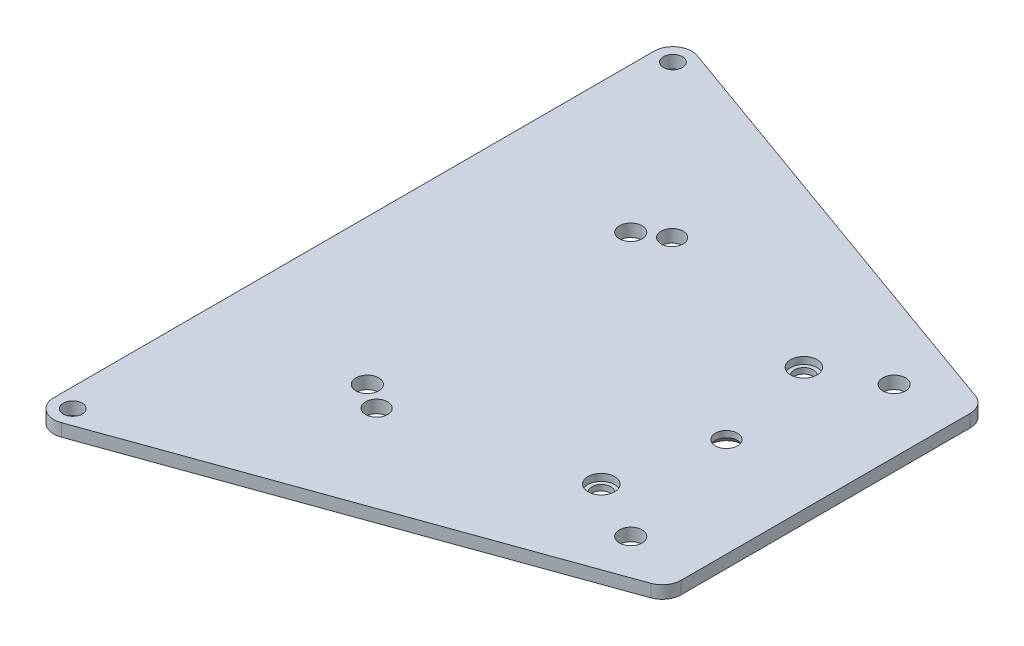
ISO-10303-21;
HEADER;
FILE_DESCRIPTION(('STEP AP214'),'2;1');
FILE_NAME('part.step','',(''),(''),'','','');
FILE_SCHEMA(('AUTOMOTIVE_DESIGN { 1 0 10303 214 1 1 1 1 }'));
ENDSEC;
DATA;
#1=APPLICATION_CONTEXT('core data for automotive mechanical design processes');
#2=APPLICATION_PROTOCOL_DEFINITION('international standard','automotive_design',2000,#1);
#3=PRODUCT_CONTEXT('',#1,'mechanical');
#4=PRODUCT('Part','Part','',(#3));
#5=PRODUCT_RELATED_PRODUCT_CATEGORY('part','',(#4));
#6=PRODUCT_DEFINITION_FORMATION('','',#4);
#7=PRODUCT_DEFINITION_CONTEXT('part definition',#1,'design');
#8=PRODUCT_DEFINITION('design','',#6,#7);
#9=PRODUCT_DEFINITION_SHAPE('','',#8);
#10=(LENGTH_UNIT() NAMED_UNIT(*) SI_UNIT(.MILLI.,.METRE.));
#11=(NAMED_UNIT(*) PLANE_ANGLE_UNIT() SI_UNIT($,.RADIAN.));
#12=(NAMED_UNIT(*) SI_UNIT($,.STERADIAN.) SOLID_ANGLE_UNIT());
#13=UNCERTAINTY_MEASURE_WITH_UNIT(LENGTH_MEASURE(1.E-05),#10,'distance_accuracy_value','');
#14=(GEOMETRIC_REPRESENTATION_CONTEXT(3) GLOBAL_UNCERTAINTY_ASSIGNED_CONTEXT((#13)) GLOBAL_UNIT_ASSIGNED_CONTEXT((#10,
#11,#12)) REPRESENTATION_CONTEXT('',''));
#15=CARTESIAN_POINT('',(0.,0.,0.));
#16=DIRECTION('',(0.,0.,1.));
#17=DIRECTION('',(1.,0.,0.));
#18=AXIS2_PLACEMENT_3D('',#15,#16,#17);
#19=CARTESIAN_POINT('',(52.22,2.,31.49));
#20=DIRECTION('',(0.,-1.,0.));
#21=DIRECTION('',(0.,0.,-1.));
#22=AXIS2_PLACEMENT_3D('',#19,#20,#21);
#23=CYLINDRICAL_SURFACE('',#22,1.5);
#24=CARTESIAN_POINT('',(52.22,0.,31.49));
#25=DIRECTION('',(0.,1.,0.));
#26=DIRECTION('',(0.,0.,1.));
#27=AXIS2_PLACEMENT_3D('',#24,#25,#26);
#28=CIRCLE('',#27,1.5);
#29=CARTESIAN_POINT('',(52.22,0.,32.99));
#30=VERTEX_POINT('',#29);
#31=EDGE_CURVE('E187',#30,#30,#28,.T.);
#32=ORIENTED_EDGE('',*,*,#31,.F.);
#33=EDGE_LOOP('',(#32));
#34=FACE_BOUND('',#33,.T.);
#35=CARTESIAN_POINT('',(52.22,0.9,31.49));
#36=DIRECTION('',(0.,1.,0.));
#37=DIRECTION('',(0.,0.,1.));
#38=AXIS2_PLACEMENT_3D('',#35,#36,#37);
#39=CIRCLE('',#38,1.5);
#40=CARTESIAN_POINT('',(52.22,0.9,32.99));
#41=VERTEX_POINT('',#40);
#42=EDGE_CURVE('E44',#41,#41,#39,.T.);
#43=ORIENTED_EDGE('',*,*,#42,.T.);
#44=EDGE_LOOP('',(#43));
#45=FACE_BOUND('',#44,.T.);
#46=ADVANCED_FACE('F41',(#34,#45),#23,.F.);
#47=CARTESIAN_POINT('',(52.22,2.,63.56));
#48=DIRECTION('',(0.,-1.,0.));
#49=DIRECTION('',(0.,0.,-1.));
#50=AXIS2_PLACEMENT_3D('',#47,#48,#49);
#51=CYLINDRICAL_SURFACE('',#50,1.5);
#52=CARTESIAN_POINT('',(52.22,0.,63.56));
#53=DIRECTION('',(0.,1.,0.));
#54=DIRECTION('',(0.,0.,1.));
#55=AXIS2_PLACEMENT_3D('',#52,#53,#54);
#56=CIRCLE('',#55,1.5);
#57=CARTESIAN_POINT('',(52.22,0.,65.06));
#58=VERTEX_POINT('',#57);
#59=EDGE_CURVE('E182',#58,#58,#56,.T.);
#60=ORIENTED_EDGE('',*,*,#59,.F.);
#61=EDGE_LOOP('',(#60));
#62=FACE_BOUND('',#61,.T.);
#63=CARTESIAN_POINT('',(52.22,0.9,63.56));
#64=DIRECTION('',(0.,1.,0.));
#65=DIRECTION('',(0.,0.,1.));
#66=AXIS2_PLACEMENT_3D('',#63,#64,#65);
#67=CIRCLE('',#66,1.5);
#68=CARTESIAN_POINT('',(52.22,0.9,65.06));
#69=VERTEX_POINT('',#68);
#70=EDGE_CURVE('E213',#69,#69,#67,.T.);
#71=ORIENTED_EDGE('',*,*,#70,.T.);
#72=EDGE_LOOP('',(#71));
#73=FACE_BOUND('',#72,.T.);
#74=ADVANCED_FACE('F288',(#62,#73),#51,.F.);
#75=CARTESIAN_POINT('',(56.,2.,47.525));
#76=DIRECTION('',(0.,-1.,0.));
#77=DIRECTION('',(0.,0.,-1.));
#78=AXIS2_PLACEMENT_3D('',#75,#76,#77);
#79=CYLINDRICAL_SURFACE('',#78,1.75);
#80=CARTESIAN_POINT('',(56.,2.,47.525));
#81=DIRECTION('',(0.,1.,0.));
#82=DIRECTION('',(0.,0.,1.));
#83=AXIS2_PLACEMENT_3D('',#80,#81,#82);
#84=CIRCLE('',#83,1.75);
#85=CARTESIAN_POINT('',(56.,2.,49.275));
#86=VERTEX_POINT('',#85);
#87=EDGE_CURVE('E245',#86,#86,#84,.T.);
#88=ORIENTED_EDGE('',*,*,#87,.T.);
#89=EDGE_LOOP('',(#88));
#90=FACE_BOUND('',#89,.T.);
#91=CARTESIAN_POINT('',(56.,1.,47.525));
#92=DIRECTION('',(0.,-1.,0.));
#93=DIRECTION('',(0.,0.,-1.));
#94=AXIS2_PLACEMENT_3D('',#91,#92,#93);
#95=CIRCLE('',#94,1.75);
#96=CARTESIAN_POINT('',(56.,1.,45.775));
#97=VERTEX_POINT('',#96);
#98=EDGE_CURVE('E159',#97,#97,#95,.T.);
#99=ORIENTED_EDGE('',*,*,#98,.T.);
#100=EDGE_LOOP('',(#99));
#101=FACE_BOUND('',#100,.T.);
#102=ADVANCED_FACE('F291',(#90,#101),#79,.F.);
#103=CARTESIAN_POINT('',(68.72,2.,24.6364483396855));
#104=DIRECTION('',(0.,-1.,0.));
#105=DIRECTION('',(0.,0.,-1.));
#106=AXIS2_PLACEMENT_3D('',#103,#104,#105);
#107=CYLINDRICAL_SURFACE('',#106,3.);
#108=CARTESIAN_POINT('',(68.72,0.,24.6364483396855));
#109=DIRECTION('',(0.,1.,0.));
#110=DIRECTION('',(0.,0.,1.));
#111=AXIS2_PLACEMENT_3D('',#108,#109,#110);
#112=CIRCLE('',#111,3.);
#113=CARTESIAN_POINT('',(69.7324194513645,0.,21.8124428767837));
#114=VERTEX_POINT('',#113);
#115=CARTESIAN_POINT('',(71.72,0.,24.6364483396855));
#116=VERTEX_POINT('',#115);
#117=EDGE_CURVE('E161',#114,#116,#112,.F.);
#118=ORIENTED_EDGE('',*,*,#117,.F.);
#119=DIRECTION('',(0.,-1.,0.));
#120=VECTOR('',#119,1.);
#121=CARTESIAN_POINT('',(69.7324194513645,2.,21.8124428767837));
#122=LINE('',#121,#120);
#123=CARTESIAN_POINT('',(69.7324194513645,2.,21.8124428767837));
#124=VERTEX_POINT('',#123);
#125=EDGE_CURVE('E11',#124,#114,#122,.T.);
#126=ORIENTED_EDGE('',*,*,#125,.F.);
#127=CARTESIAN_POINT('',(68.72,2.,24.6364483396855));
#128=DIRECTION('',(0.,1.,0.));
#129=DIRECTION('',(0.,0.,1.));
#130=AXIS2_PLACEMENT_3D('',#127,#128,#129);
#131=CIRCLE('',#130,3.);
#132=CARTESIAN_POINT('',(71.72,2.,24.6364483396855));
#133=VERTEX_POINT('',#132);
#134=EDGE_CURVE('E252',#124,#133,#131,.F.);
#135=ORIENTED_EDGE('',*,*,#134,.T.);
#136=DIRECTION('',(0.,-1.,0.));
#137=VECTOR('',#136,1.);
#138=CARTESIAN_POINT('',(71.72,2.,24.6364483396855));
#139=LINE('',#138,#137);
#140=EDGE_CURVE('E58',#133,#116,#139,.T.);
#141=ORIENTED_EDGE('',*,*,#140,.T.);
#142=EDGE_LOOP('',(#118,#126,#135,#141));
#143=FACE_BOUND('',#142,.T.);
#144=ADVANCED_FACE('F397',(#143),#107,.T.);
#145=CARTESIAN_POINT('',(1.01241945136449,2.,-2.82400546290173));
#146=DIRECTION('',(0.337473150454831,0.,-0.941335154300577));
#147=DIRECTION('',(-0.941335154300577,0.,-0.337473150454831));
#148=AXIS2_PLACEMENT_3D('',#145,#146,#147);
#149=PLANE('',#148);
#150=DIRECTION('',(0.941335154300577,0.,0.337473150454831));
#151=VECTOR('',#150,1.);
#152=CARTESIAN_POINT('',(1.01241945136449,0.,-2.82400546290173));
#153=LINE('',#152,#151);
#154=CARTESIAN_POINT('',(1.01241945136449,0.,-2.82400546290173));
#155=VERTEX_POINT('',#154);
#156=EDGE_CURVE('E164',#155,#114,#153,.T.);
#157=ORIENTED_EDGE('',*,*,#156,.F.);
#158=DIRECTION('',(0.,-1.,0.));
#159=VECTOR('',#158,1.);
#160=CARTESIAN_POINT('',(1.01241945136449,2.,-2.82400546290173));
#161=LINE('',#160,#159);
#162=CARTESIAN_POINT('',(1.01241945136449,2.,-2.82400546290173));
#163=VERTEX_POINT('',#162);
#164=EDGE_CURVE('E51',#163,#155,#161,.T.);
#165=ORIENTED_EDGE('',*,*,#164,.F.);
#166=DIRECTION('',(0.941335154300577,0.,0.337473150454831));
#167=VECTOR('',#166,1.);
#168=CARTESIAN_POINT('',(1.01241945136449,2.,-2.82400546290173));
#169=LINE('',#168,#167);
#170=EDGE_CURVE('E254',#163,#124,#169,.T.);
#171=ORIENTED_EDGE('',*,*,#170,.T.);
#172=ORIENTED_EDGE('',*,*,#125,.T.);
#173=EDGE_LOOP('',(#157,#165,#171,#172));
#174=FACE_BOUND('',#173,.T.);
#175=ADVANCED_FACE('F489',(#174),#149,.T.);
#176=CARTESIAN_POINT('',(0.,2.,0.));
#177=DIRECTION('',(0.,-1.,0.));
#178=DIRECTION('',(0.,0.,-1.));
#179=AXIS2_PLACEMENT_3D('',#176,#177,#178);
#180=CYLINDRICAL_SURFACE('',#179,3.);
#181=CARTESIAN_POINT('',(0.,0.,0.));
#182=DIRECTION('',(0.,1.,0.));
#183=DIRECTION('',(0.,0.,1.));
#184=AXIS2_PLACEMENT_3D('',#181,#182,#183);
#185=CIRCLE('',#184,3.);
#186=CARTESIAN_POINT('',(-3.,0.,0.));
#187=VERTEX_POINT('',#186);
#188=EDGE_CURVE('E166',#187,#155,#185,.F.);
#189=ORIENTED_EDGE('',*,*,#188,.F.);
#190=DIRECTION('',(0.,-1.,0.));
#191=VECTOR('',#190,1.);
#192=CARTESIAN_POINT('',(-3.,2.,0.));
#193=LINE('',#192,#191);
#194=CARTESIAN_POINT('',(-3.,2.,0.));
#195=VERTEX_POINT('',#194);
#196=EDGE_CURVE('E208',#195,#187,#193,.T.);
#197=ORIENTED_EDGE('',*,*,#196,.F.);
#198=CARTESIAN_POINT('',(0.,2.,0.));
#199=DIRECTION('',(0.,1.,0.));
#200=DIRECTION('',(0.,0.,1.));
#201=AXIS2_PLACEMENT_3D('',#198,#199,#200);
#202=CIRCLE('',#201,3.);
#203=EDGE_CURVE('E257',#195,#163,#202,.F.);
#204=ORIENTED_EDGE('',*,*,#203,.T.);
#205=ORIENTED_EDGE('',*,*,#164,.T.);
#206=EDGE_LOOP('',(#189,#197,#204,#205));
#207=FACE_BOUND('',#206,.T.);
#208=ADVANCED_FACE('F483',(#207),#180,.T.);
#209=CARTESIAN_POINT('',(-3.,2.,0.));
#210=DIRECTION('',(-1.,0.,0.));
#211=DIRECTION('',(0.,0.,1.));
#212=AXIS2_PLACEMENT_3D('',#209,#210,#211);
#213=PLANE('',#212);
#214=DIRECTION('',(0.,0.,-1.));
#215=VECTOR('',#214,1.);
#216=CARTESIAN_POINT('',(-3.,0.,0.));
#217=LINE('',#216,#215);
#218=CARTESIAN_POINT('',(-3.,0.,95.05));
#219=VERTEX_POINT('',#218);
#220=EDGE_CURVE('E171',#219,#187,#217,.T.);
#221=ORIENTED_EDGE('',*,*,#220,.F.);
#222=DIRECTION('',(0.,-1.,0.));
#223=VECTOR('',#222,1.);
#224=CARTESIAN_POINT('',(-3.,2.,95.05));
#225=LINE('',#224,#223);
#226=CARTESIAN_POINT('',(-3.,2.,95.05));
#227=VERTEX_POINT('',#226);
#228=EDGE_CURVE('E206',#227,#219,#225,.T.);
#229=ORIENTED_EDGE('',*,*,#228,.F.);
#230=DIRECTION('',(0.,0.,-1.));
#231=VECTOR('',#230,1.);
#232=CARTESIAN_POINT('',(-3.,2.,0.));
#233=LINE('',#232,#231);
#234=EDGE_CURVE('E256',#227,#195,#233,.T.);
#235=ORIENTED_EDGE('',*,*,#234,.T.);
#236=ORIENTED_EDGE('',*,*,#196,.T.);
#237=EDGE_LOOP('',(#221,#229,#235,#236));
#238=FACE_BOUND('',#237,.T.);
#239=ADVANCED_FACE('F474',(#238),#213,.T.);
#240=CARTESIAN_POINT('',(0.,2.,95.05));
#241=DIRECTION('',(0.,-1.,0.));
#242=DIRECTION('',(0.,0.,-1.));
#243=AXIS2_PLACEMENT_3D('',#240,#241,#242);
#244=CYLINDRICAL_SURFACE('',#243,3.);
#245=CARTESIAN_POINT('',(0.,0.,95.05));
#246=DIRECTION('',(0.,1.,0.));
#247=DIRECTION('',(0.,0.,1.));
#248=AXIS2_PLACEMENT_3D('',#245,#246,#247);
#249=CIRCLE('',#248,3.);
#250=CARTESIAN_POINT('',(1.01241945136449,0.,97.8740054629017));
#251=VERTEX_POINT('',#250);
#252=EDGE_CURVE('E172',#251,#219,#249,.F.);
#253=ORIENTED_EDGE('',*,*,#252,.F.);
#254=DIRECTION('',(0.,-1.,0.));
#255=VECTOR('',#254,1.);
#256=CARTESIAN_POINT('',(1.01241945136449,2.,97.8740054629017));
#257=LINE('',#256,#255);
#258=CARTESIAN_POINT('',(1.01241945136449,2.,97.8740054629017));
#259=VERTEX_POINT('',#258);
#260=EDGE_CURVE('E118',#259,#251,#257,.T.);
#261=ORIENTED_EDGE('',*,*,#260,.F.);
#262=CARTESIAN_POINT('',(0.,2.,95.05));
#263=DIRECTION('',(0.,1.,0.));
#264=DIRECTION('',(0.,0.,1.));
#265=AXIS2_PLACEMENT_3D('',#262,#263,#264);
#266=CIRCLE('',#265,3.);
#267=EDGE_CURVE('E128',#259,#227,#266,.F.);
#268=ORIENTED_EDGE('',*,*,#267,.T.);
#269=ORIENTED_EDGE('',*,*,#228,.T.);
#270=EDGE_LOOP('',(#253,#261,#268,#269));
#271=FACE_BOUND('',#270,.T.);
#272=ADVANCED_FACE('F263',(#271),#244,.T.);
#273=CARTESIAN_POINT('',(31.2074605331638,2.,87.0489389651365));
#274=DIRECTION('',(0.337473150454831,0.,0.941335154300577));
#275=DIRECTION('',(0.941335154300577,0.,-0.337473150454831));
#276=AXIS2_PLACEMENT_3D('',#273,#274,#275);
#277=PLANE('',#276);
#278=DIRECTION('',(-0.941335154300577,0.,0.337473150454831));
#279=VECTOR('',#278,1.);
#280=CARTESIAN_POINT('',(31.2074605331638,0.,87.0489389651365));
#281=LINE('',#280,#279);
#282=CARTESIAN_POINT('',(69.7324194513645,0.,73.2375571232163));
#283=VERTEX_POINT('',#282);
#284=EDGE_CURVE('E114',#283,#251,#281,.T.);
#285=ORIENTED_EDGE('',*,*,#284,.F.);
#286=DIRECTION('',(0.,-1.,0.));
#287=VECTOR('',#286,1.);
#288=CARTESIAN_POINT('',(69.7324194513645,2.,73.2375571232163));
#289=LINE('',#288,#287);
#290=CARTESIAN_POINT('',(69.7324194513645,2.,73.2375571232163));
#291=VERTEX_POINT('',#290);
#292=EDGE_CURVE('E109',#291,#283,#289,.T.);
#293=ORIENTED_EDGE('',*,*,#292,.F.);
#294=DIRECTION('',(-0.941335154300577,0.,0.337473150454831));
#295=VECTOR('',#294,1.);
#296=CARTESIAN_POINT('',(31.2074605331638,2.,87.0489389651365));
#297=LINE('',#296,#295);
#298=EDGE_CURVE('E113',#291,#259,#297,.T.);
#299=ORIENTED_EDGE('',*,*,#298,.T.);
#300=ORIENTED_EDGE('',*,*,#260,.T.);
#301=EDGE_LOOP('',(#285,#293,#299,#300));
#302=FACE_BOUND('',#301,.T.);
#303=ADVANCED_FACE('F115',(#302),#277,.T.);
#304=CARTESIAN_POINT('',(68.72,2.,70.4135516603145));
#305=DIRECTION('',(0.,-1.,0.));
#306=DIRECTION('',(0.,0.,-1.));
#307=AXIS2_PLACEMENT_3D('',#304,#305,#306);
#308=CYLINDRICAL_SURFACE('',#307,3.);
#309=CARTESIAN_POINT('',(68.72,0.,70.4135516603145));
#310=DIRECTION('',(0.,1.,0.));
#311=DIRECTION('',(0.,0.,1.));
#312=AXIS2_PLACEMENT_3D('',#309,#310,#311);
#313=CIRCLE('',#312,3.);
#314=CARTESIAN_POINT('',(71.72,0.,70.4135516603145));
#315=VERTEX_POINT('',#314);
#316=EDGE_CURVE('E178',#315,#283,#313,.F.);
#317=ORIENTED_EDGE('',*,*,#316,.F.);
#318=DIRECTION('',(0.,-1.,0.));
#319=VECTOR('',#318,1.);
#320=CARTESIAN_POINT('',(71.72,2.,70.4135516603145));
#321=LINE('',#320,#319);
#322=CARTESIAN_POINT('',(71.72,2.,70.4135516603145));
#323=VERTEX_POINT('',#322);
#324=EDGE_CURVE('E83',#323,#315,#321,.T.);
#325=ORIENTED_EDGE('',*,*,#324,.F.);
#326=CARTESIAN_POINT('',(68.72,2.,70.4135516603145));
#327=DIRECTION('',(0.,1.,0.));
#328=DIRECTION('',(0.,0.,1.));
#329=AXIS2_PLACEMENT_3D('',#326,#327,#328);
#330=CIRCLE('',#329,3.);
#331=EDGE_CURVE('E130',#323,#291,#330,.F.);
#332=ORIENTED_EDGE('',*,*,#331,.T.);
#333=ORIENTED_EDGE('',*,*,#292,.T.);
#334=EDGE_LOOP('',(#317,#325,#332,#333));
#335=FACE_BOUND('',#334,.T.);
#336=ADVANCED_FACE('F135',(#335),#308,.T.);
#337=CARTESIAN_POINT('',(20.,2.,68.395));
#338=DIRECTION('',(0.,-1.,0.));
#339=DIRECTION('',(0.,0.,-1.));
#340=AXIS2_PLACEMENT_3D('',#337,#338,#339);
#341=CYLINDRICAL_SURFACE('',#340,1.79999999999999);
#342=CARTESIAN_POINT('',(20.,2.,68.395));
#343=DIRECTION('',(0.,1.,0.));
#344=DIRECTION('',(0.,0.,1.));
#345=AXIS2_PLACEMENT_3D('',#342,#343,#344);
#346=CIRCLE('',#345,1.79999999999999);
#347=CARTESIAN_POINT('',(20.,2.,70.195));
#348=VERTEX_POINT('',#347);
#349=EDGE_CURVE('E150',#348,#348,#346,.T.);
#350=ORIENTED_EDGE('',*,*,#349,.T.);
#351=EDGE_LOOP('',(#350));
#352=FACE_BOUND('',#351,.T.);
#353=CARTESIAN_POINT('',(20.,0.,68.395));
#354=DIRECTION('',(0.,1.,0.));
#355=DIRECTION('',(0.,0.,1.));
#356=AXIS2_PLACEMENT_3D('',#353,#354,#355);
#357=CIRCLE('',#356,1.79999999999999);
#358=CARTESIAN_POINT('',(20.,0.,70.195));
#359=VERTEX_POINT('',#358);
#360=EDGE_CURVE('E198',#359,#359,#357,.T.);
#361=ORIENTED_EDGE('',*,*,#360,.F.);
#362=EDGE_LOOP('',(#361));
#363=FACE_BOUND('',#362,.T.);
#364=ADVANCED_FACE('F302',(#352,#363),#341,.F.);
#365=CARTESIAN_POINT('',(61.72,2.,26.675));
#366=DIRECTION('',(0.,-1.,0.));
#367=DIRECTION('',(0.,0.,-1.));
#368=AXIS2_PLACEMENT_3D('',#365,#366,#367);
#369=CYLINDRICAL_SURFACE('',#368,1.79999999999999);
#370=CARTESIAN_POINT('',(61.72,2.,26.675));
#371=DIRECTION('',(0.,1.,0.));
#372=DIRECTION('',(0.,0.,1.));
#373=AXIS2_PLACEMENT_3D('',#370,#371,#372);
#374=CIRCLE('',#373,1.79999999999999);
#375=CARTESIAN_POINT('',(61.72,2.,28.475));
#376=VERTEX_POINT('',#375);
#377=EDGE_CURVE('E144',#376,#376,#374,.T.);
#378=ORIENTED_EDGE('',*,*,#377,.T.);
#379=EDGE_LOOP('',(#378));
#380=FACE_BOUND('',#379,.T.);
#381=CARTESIAN_POINT('',(61.72,0.,26.675));
#382=DIRECTION('',(0.,1.,0.));
#383=DIRECTION('',(0.,0.,1.));
#384=AXIS2_PLACEMENT_3D('',#381,#382,#383);
#385=CIRCLE('',#384,1.79999999999999);
#386=CARTESIAN_POINT('',(61.72,0.,28.475));
#387=VERTEX_POINT('',#386);
#388=EDGE_CURVE('E193',#387,#387,#385,.T.);
#389=ORIENTED_EDGE('',*,*,#388,.F.);
#390=EDGE_LOOP('',(#389));
#391=FACE_BOUND('',#390,.T.);
#392=ADVANCED_FACE('F297',(#380,#391),#369,.F.);
#393=CARTESIAN_POINT('',(61.72,2.,68.395));
#394=DIRECTION('',(0.,-1.,0.));
#395=DIRECTION('',(0.,0.,-1.));
#396=AXIS2_PLACEMENT_3D('',#393,#394,#395);
#397=CYLINDRICAL_SURFACE('',#396,1.79999999999997);
#398=CARTESIAN_POINT('',(61.72,2.,68.395));
#399=DIRECTION('',(0.,1.,0.));
#400=DIRECTION('',(0.,0.,1.));
#401=AXIS2_PLACEMENT_3D('',#398,#399,#400);
#402=CIRCLE('',#401,1.79999999999997);
#403=CARTESIAN_POINT('',(61.72,2.,70.195));
#404=VERTEX_POINT('',#403);
#405=EDGE_CURVE('E142',#404,#404,#402,.T.);
#406=ORIENTED_EDGE('',*,*,#405,.T.);
#407=EDGE_LOOP('',(#406));
#408=FACE_BOUND('',#407,.T.);
#409=CARTESIAN_POINT('',(61.72,0.,68.395));
#410=DIRECTION('',(0.,1.,0.));
#411=DIRECTION('',(0.,0.,1.));
#412=AXIS2_PLACEMENT_3D('',#409,#410,#411);
#413=CIRCLE('',#412,1.79999999999997);
#414=CARTESIAN_POINT('',(61.72,0.,70.195));
#415=VERTEX_POINT('',#414);
#416=EDGE_CURVE('E195',#415,#415,#413,.T.);
#417=ORIENTED_EDGE('',*,*,#416,.F.);
#418=EDGE_LOOP('',(#417));
#419=FACE_BOUND('',#418,.T.);
#420=ADVANCED_FACE('F278',(#408,#419),#397,.F.);
#421=CARTESIAN_POINT('',(0.,2.,0.));
#422=DIRECTION('',(0.,-1.,0.));
#423=DIRECTION('',(0.,0.,-1.));
#424=AXIS2_PLACEMENT_3D('',#421,#422,#423);
#425=CYLINDRICAL_SURFACE('',#424,1.5);
#426=CARTESIAN_POINT('',(0.,2.,0.));
#427=DIRECTION('',(0.,1.,0.));
#428=DIRECTION('',(0.,0.,1.));
#429=AXIS2_PLACEMENT_3D('',#426,#427,#428);
#430=CIRCLE('',#429,1.5);
#431=CARTESIAN_POINT('',(0.,2.,1.5));
#432=VERTEX_POINT('',#431);
#433=EDGE_CURVE('E134',#432,#432,#430,.T.);
#434=ORIENTED_EDGE('',*,*,#433,.T.);
#435=EDGE_LOOP('',(#434));
#436=FACE_BOUND('',#435,.T.);
#437=CARTESIAN_POINT('',(0.,0.,0.));
#438=DIRECTION('',(0.,1.,0.));
#439=DIRECTION('',(0.,0.,1.));
#440=AXIS2_PLACEMENT_3D('',#437,#438,#439);
#441=CIRCLE('',#440,1.5);
#442=CARTESIAN_POINT('',(0.,0.,1.5));
#443=VERTEX_POINT('',#442);
#444=EDGE_CURVE('E186',#443,#443,#441,.T.);
#445=ORIENTED_EDGE('',*,*,#444,.F.);
#446=EDGE_LOOP('',(#445));
#447=FACE_BOUND('',#446,.T.);
#448=ADVANCED_FACE('F272',(#436,#447),#425,.F.);
#449=CARTESIAN_POINT('',(71.72,2.,0.));
#450=DIRECTION('',(1.,0.,0.));
#451=DIRECTION('',(0.,0.,-1.));
#452=AXIS2_PLACEMENT_3D('',#449,#450,#451);
#453=PLANE('',#452);
#454=DIRECTION('',(0.,0.,1.));
#455=VECTOR('',#454,1.);
#456=CARTESIAN_POINT('',(71.72,0.,0.));
#457=LINE('',#456,#455);
#458=EDGE_CURVE('E179',#116,#315,#457,.T.);
#459=ORIENTED_EDGE('',*,*,#458,.F.);
#460=ORIENTED_EDGE('',*,*,#140,.F.);
#461=DIRECTION('',(0.,0.,1.));
#462=VECTOR('',#461,1.);
#463=CARTESIAN_POINT('',(71.72,2.,0.));
#464=LINE('',#463,#462);
#465=EDGE_CURVE('E133',#133,#323,#464,.T.);
#466=ORIENTED_EDGE('',*,*,#465,.T.);
#467=ORIENTED_EDGE('',*,*,#324,.T.);
#468=EDGE_LOOP('',(#459,#460,#466,#467));
#469=FACE_BOUND('',#468,.T.);
#470=ADVANCED_FACE('F267',(#469),#453,.T.);
#471=CARTESIAN_POINT('',(24.,2.,70.925));
#472=DIRECTION('',(0.,-1.,0.));
#473=DIRECTION('',(0.,0.,-1.));
#474=AXIS2_PLACEMENT_3D('',#471,#472,#473);
#475=CYLINDRICAL_SURFACE('',#474,1.75);
#476=CARTESIAN_POINT('',(24.,2.,70.925));
#477=DIRECTION('',(0.,1.,0.));
#478=DIRECTION('',(0.,0.,1.));
#479=AXIS2_PLACEMENT_3D('',#476,#477,#478);
#480=CIRCLE('',#479,1.75);
#481=CARTESIAN_POINT('',(24.,2.,72.675));
#482=VERTEX_POINT('',#481);
#483=EDGE_CURVE('E247',#482,#482,#480,.T.);
#484=ORIENTED_EDGE('',*,*,#483,.T.);
#485=EDGE_LOOP('',(#484));
#486=FACE_BOUND('',#485,.T.);
#487=CARTESIAN_POINT('',(24.,0.,70.925));
#488=DIRECTION('',(0.,1.,0.));
#489=DIRECTION('',(0.,0.,1.));
#490=AXIS2_PLACEMENT_3D('',#487,#488,#489);
#491=CIRCLE('',#490,1.75);
#492=CARTESIAN_POINT('',(24.,0.,72.675));
#493=VERTEX_POINT('',#492);
#494=EDGE_CURVE('E156',#493,#493,#491,.T.);
#495=ORIENTED_EDGE('',*,*,#494,.F.);
#496=EDGE_LOOP('',(#495));
#497=FACE_BOUND('',#496,.T.);
#498=ADVANCED_FACE('F266',(#486,#497),#475,.F.);
#499=CARTESIAN_POINT('',(24.,2.,24.125));
#500=DIRECTION('',(0.,-1.,0.));
#501=DIRECTION('',(0.,0.,-1.));
#502=AXIS2_PLACEMENT_3D('',#499,#500,#501);
#503=CYLINDRICAL_SURFACE('',#502,1.75);
#504=CARTESIAN_POINT('',(24.,2.,24.125));
#505=DIRECTION('',(0.,1.,0.));
#506=DIRECTION('',(0.,0.,1.));
#507=AXIS2_PLACEMENT_3D('',#504,#505,#506);
#508=CIRCLE('',#507,1.75);
#509=CARTESIAN_POINT('',(24.,2.,25.875));
#510=VERTEX_POINT('',#509);
#511=EDGE_CURVE('E244',#510,#510,#508,.T.);
#512=ORIENTED_EDGE('',*,*,#511,.T.);
#513=EDGE_LOOP('',(#512));
#514=FACE_BOUND('',#513,.T.);
#515=CARTESIAN_POINT('',(24.,0.,24.125));
#516=DIRECTION('',(0.,1.,0.));
#517=DIRECTION('',(0.,0.,1.));
#518=AXIS2_PLACEMENT_3D('',#515,#516,#517);
#519=CIRCLE('',#518,1.75);
#520=CARTESIAN_POINT('',(24.,0.,25.875));
#521=VERTEX_POINT('',#520);
#522=EDGE_CURVE('E158',#521,#521,#519,.T.);
#523=ORIENTED_EDGE('',*,*,#522,.F.);
#524=EDGE_LOOP('',(#523));
#525=FACE_BOUND('',#524,.T.);
#526=ADVANCED_FACE('F280',(#514,#525),#503,.F.);
#527=CARTESIAN_POINT('',(0.,2.,95.05));
#528=DIRECTION('',(0.,-1.,0.));
#529=DIRECTION('',(0.,0.,-1.));
#530=AXIS2_PLACEMENT_3D('',#527,#528,#529);
#531=CYLINDRICAL_SURFACE('',#530,1.5);
#532=CARTESIAN_POINT('',(0.,2.,95.05));
#533=DIRECTION('',(0.,1.,0.));
#534=DIRECTION('',(0.,0.,1.));
#535=AXIS2_PLACEMENT_3D('',#532,#533,#534);
#536=CIRCLE('',#535,1.5);
#537=CARTESIAN_POINT('',(0.,2.,96.55));
#538=VERTEX_POINT('',#537);
#539=EDGE_CURVE('E205',#538,#538,#536,.T.);
#540=ORIENTED_EDGE('',*,*,#539,.T.);
#541=EDGE_LOOP('',(#540));
#542=FACE_BOUND('',#541,.T.);
#543=CARTESIAN_POINT('',(0.,0.,95.05));
#544=DIRECTION('',(0.,1.,0.));
#545=DIRECTION('',(0.,0.,1.));
#546=AXIS2_PLACEMENT_3D('',#543,#544,#545);
#547=CIRCLE('',#546,1.5);
#548=CARTESIAN_POINT('',(0.,0.,96.55));
#549=VERTEX_POINT('',#548);
#550=EDGE_CURVE('E153',#549,#549,#547,.T.);
#551=ORIENTED_EDGE('',*,*,#550,.F.);
#552=EDGE_LOOP('',(#551));
#553=FACE_BOUND('',#552,.T.);
#554=ADVANCED_FACE('F43',(#542,#553),#531,.F.);
#555=CARTESIAN_POINT('',(20.,2.,26.675));
#556=DIRECTION('',(0.,-1.,0.));
#557=DIRECTION('',(0.,0.,-1.));
#558=AXIS2_PLACEMENT_3D('',#555,#556,#557);
#559=CYLINDRICAL_SURFACE('',#558,1.79999999999999);
#560=CARTESIAN_POINT('',(20.,2.,26.675));
#561=DIRECTION('',(0.,1.,0.));
#562=DIRECTION('',(0.,0.,1.));
#563=AXIS2_PLACEMENT_3D('',#560,#561,#562);
#564=CIRCLE('',#563,1.79999999999999);
#565=CARTESIAN_POINT('',(20.,2.,28.475));
#566=VERTEX_POINT('',#565);
#567=EDGE_CURVE('E148',#566,#566,#564,.T.);
#568=ORIENTED_EDGE('',*,*,#567,.T.);
#569=EDGE_LOOP('',(#568));
#570=FACE_BOUND('',#569,.T.);
#571=CARTESIAN_POINT('',(20.,0.,26.675));
#572=DIRECTION('',(0.,1.,0.));
#573=DIRECTION('',(0.,0.,1.));
#574=AXIS2_PLACEMENT_3D('',#571,#572,#573);
#575=CIRCLE('',#574,1.79999999999999);
#576=CARTESIAN_POINT('',(20.,0.,28.475));
#577=VERTEX_POINT('',#576);
#578=EDGE_CURVE('E203',#577,#577,#575,.T.);
#579=ORIENTED_EDGE('',*,*,#578,.F.);
#580=EDGE_LOOP('',(#579));
#581=FACE_BOUND('',#580,.T.);
#582=ADVANCED_FACE('F307',(#570,#581),#559,.F.);
#583=CARTESIAN_POINT('',(0.,2.,0.));
#584=DIRECTION('',(0.,1.,0.));
#585=DIRECTION('',(0.,0.,1.));
#586=AXIS2_PLACEMENT_3D('',#583,#584,#585);
#587=PLANE('',#586);
#588=CARTESIAN_POINT('',(52.22,2.,31.49));
#589=DIRECTION('',(0.,1.,0.));
#590=DIRECTION('',(0.,0.,1.));
#591=AXIS2_PLACEMENT_3D('',#588,#589,#590);
#592=CIRCLE('',#591,2.1);
#593=CARTESIAN_POINT('',(52.22,2.,33.59));
#594=VERTEX_POINT('',#593);
#595=EDGE_CURVE('E222',#594,#594,#592,.T.);
#596=ORIENTED_EDGE('',*,*,#595,.F.);
#597=EDGE_LOOP('',(#596));
#598=FACE_BOUND('',#597,.T.);
#599=CARTESIAN_POINT('',(52.22,2.,63.56));
#600=DIRECTION('',(0.,1.,0.));
#601=DIRECTION('',(0.,0.,1.));
#602=AXIS2_PLACEMENT_3D('',#599,#600,#601);
#603=CIRCLE('',#602,2.1);
#604=CARTESIAN_POINT('',(52.22,2.,65.66));
#605=VERTEX_POINT('',#604);
#606=EDGE_CURVE('E226',#605,#605,#603,.T.);
#607=ORIENTED_EDGE('',*,*,#606,.F.);
#608=EDGE_LOOP('',(#607));
#609=FACE_BOUND('',#608,.T.);
#610=ORIENTED_EDGE('',*,*,#539,.F.);
#611=EDGE_LOOP('',(#610));
#612=FACE_BOUND('',#611,.T.);
#613=ORIENTED_EDGE('',*,*,#87,.F.);
#614=EDGE_LOOP('',(#613));
#615=FACE_BOUND('',#614,.T.);
#616=ORIENTED_EDGE('',*,*,#511,.F.);
#617=EDGE_LOOP('',(#616));
#618=FACE_BOUND('',#617,.T.);
#619=ORIENTED_EDGE('',*,*,#483,.F.);
#620=EDGE_LOOP('',(#619));
#621=FACE_BOUND('',#620,.T.);
#622=ORIENTED_EDGE('',*,*,#134,.F.);
#623=ORIENTED_EDGE('',*,*,#170,.F.);
#624=ORIENTED_EDGE('',*,*,#203,.F.);
#625=ORIENTED_EDGE('',*,*,#234,.F.);
#626=ORIENTED_EDGE('',*,*,#267,.F.);
#627=ORIENTED_EDGE('',*,*,#298,.F.);
#628=ORIENTED_EDGE('',*,*,#331,.F.);
#629=ORIENTED_EDGE('',*,*,#465,.F.);
#630=EDGE_LOOP('',(#622,#623,#624,#625,#626,#627,#628,#629));
#631=FACE_BOUND('',#630,.T.);
#632=ORIENTED_EDGE('',*,*,#433,.F.);
#633=EDGE_LOOP('',(#632));
#634=FACE_BOUND('',#633,.T.);
#635=ORIENTED_EDGE('',*,*,#405,.F.);
#636=EDGE_LOOP('',(#635));
#637=FACE_BOUND('',#636,.T.);
#638=ORIENTED_EDGE('',*,*,#377,.F.);
#639=EDGE_LOOP('',(#638));
#640=FACE_BOUND('',#639,.T.);
#641=ORIENTED_EDGE('',*,*,#349,.F.);
#642=EDGE_LOOP('',(#641));
#643=FACE_BOUND('',#642,.T.);
#644=ORIENTED_EDGE('',*,*,#567,.F.);
#645=EDGE_LOOP('',(#644));
#646=FACE_BOUND('',#645,.T.);
#647=ADVANCED_FACE('F121',(#598,#609,#612,#615,#618,#621,#631,#634,#637,#640,#643,#646),#587,.T.);
#648=CARTESIAN_POINT('',(0.,0.,0.));
#649=DIRECTION('',(0.,1.,0.));
#650=DIRECTION('',(0.,0.,1.));
#651=AXIS2_PLACEMENT_3D('',#648,#649,#650);
#652=PLANE('',#651);
#653=CARTESIAN_POINT('',(56.,0.,47.525));
#654=DIRECTION('',(0.,-1.,0.));
#655=DIRECTION('',(0.,0.,-1.));
#656=AXIS2_PLACEMENT_3D('',#653,#654,#655);
#657=CIRCLE('',#656,2.6);
#658=CARTESIAN_POINT('',(56.,0.,44.925));
#659=VERTEX_POINT('',#658);
#660=EDGE_CURVE('E223',#659,#659,#657,.T.);
#661=ORIENTED_EDGE('',*,*,#660,.F.);
#662=EDGE_LOOP('',(#661));
#663=FACE_BOUND('',#662,.T.);
#664=ORIENTED_EDGE('',*,*,#550,.T.);
#665=EDGE_LOOP('',(#664));
#666=FACE_BOUND('',#665,.T.);
#667=ORIENTED_EDGE('',*,*,#522,.T.);
#668=EDGE_LOOP('',(#667));
#669=FACE_BOUND('',#668,.T.);
#670=ORIENTED_EDGE('',*,*,#494,.T.);
#671=EDGE_LOOP('',(#670));
#672=FACE_BOUND('',#671,.T.);
#673=ORIENTED_EDGE('',*,*,#117,.T.);
#674=ORIENTED_EDGE('',*,*,#458,.T.);
#675=ORIENTED_EDGE('',*,*,#316,.T.);
#676=ORIENTED_EDGE('',*,*,#284,.T.);
#677=ORIENTED_EDGE('',*,*,#252,.T.);
#678=ORIENTED_EDGE('',*,*,#220,.T.);
#679=ORIENTED_EDGE('',*,*,#188,.T.);
#680=ORIENTED_EDGE('',*,*,#156,.T.);
#681=EDGE_LOOP('',(#673,#674,#675,#676,#677,#678,#679,#680));
#682=FACE_BOUND('',#681,.T.);
#683=ORIENTED_EDGE('',*,*,#59,.T.);
#684=EDGE_LOOP('',(#683));
#685=FACE_BOUND('',#684,.T.);
#686=ORIENTED_EDGE('',*,*,#31,.T.);
#687=EDGE_LOOP('',(#686));
#688=FACE_BOUND('',#687,.T.);
#689=ORIENTED_EDGE('',*,*,#444,.T.);
#690=EDGE_LOOP('',(#689));
#691=FACE_BOUND('',#690,.T.);
#692=ORIENTED_EDGE('',*,*,#416,.T.);
#693=EDGE_LOOP('',(#692));
#694=FACE_BOUND('',#693,.T.);
#695=ORIENTED_EDGE('',*,*,#388,.T.);
#696=EDGE_LOOP('',(#695));
#697=FACE_BOUND('',#696,.T.);
#698=ORIENTED_EDGE('',*,*,#360,.T.);
#699=EDGE_LOOP('',(#698));
#700=FACE_BOUND('',#699,.T.);
#701=ORIENTED_EDGE('',*,*,#578,.T.);
#702=EDGE_LOOP('',(#701));
#703=FACE_BOUND('',#702,.T.);
#704=ADVANCED_FACE('F268',(#663,#666,#669,#672,#682,#685,#688,#691,#694,#697,#700,#703),#652,.F.);
#705=CARTESIAN_POINT('',(56.,0.,47.525));
#706=DIRECTION('',(0.,-1.,0.));
#707=DIRECTION('',(0.,0.,-1.));
#708=AXIS2_PLACEMENT_3D('',#705,#706,#707);
#709=CONICAL_SURFACE('',#708,2.6,0.698131700797733);
#710=CARTESIAN_POINT('',(56.,1.,47.525));
#711=DIRECTION('',(0.,-1.,0.));
#712=DIRECTION('',(0.,0.,-1.));
#713=AXIS2_PLACEMENT_3D('',#710,#711,#712);
#714=CIRCLE('',#713,1.76090036882271);
#715=CARTESIAN_POINT('',(56.,1.,45.7640996311773));
#716=VERTEX_POINT('',#715);
#717=EDGE_CURVE('E211',#716,#716,#714,.T.);
#718=ORIENTED_EDGE('',*,*,#717,.F.);
#719=EDGE_LOOP('',(#718));
#720=FACE_BOUND('',#719,.T.);
#721=ORIENTED_EDGE('',*,*,#660,.T.);
#722=EDGE_LOOP('',(#721));
#723=FACE_BOUND('',#722,.T.);
#724=ADVANCED_FACE('F314',(#720,#723),#709,.F.);
#725=CARTESIAN_POINT('',(56.,1.,47.525));
#726=DIRECTION('',(0.,-1.,0.));
#727=DIRECTION('',(0.,0.,-1.));
#728=AXIS2_PLACEMENT_3D('',#725,#726,#727);
#729=PLANE('',#728);
#730=ORIENTED_EDGE('',*,*,#98,.F.);
#731=EDGE_LOOP('',(#730));
#732=FACE_BOUND('',#731,.T.);
#733=ORIENTED_EDGE('',*,*,#717,.T.);
#734=EDGE_LOOP('',(#733));
#735=FACE_BOUND('',#734,.T.);
#736=ADVANCED_FACE('F325',(#732,#735),#729,.T.);
#737=CARTESIAN_POINT('',(52.22,0.9,63.56));
#738=DIRECTION('',(0.,1.,0.));
#739=DIRECTION('',(0.,0.,1.));
#740=AXIS2_PLACEMENT_3D('',#737,#738,#739);
#741=CYLINDRICAL_SURFACE('',#740,2.1);
#742=CARTESIAN_POINT('',(52.22,0.9,63.56));
#743=DIRECTION('',(0.,1.,0.));
#744=DIRECTION('',(0.,0.,1.));
#745=AXIS2_PLACEMENT_3D('',#742,#743,#744);
#746=CIRCLE('',#745,2.1);
#747=CARTESIAN_POINT('',(52.22,0.9,65.66));
#748=VERTEX_POINT('',#747);
#749=EDGE_CURVE('E231',#748,#748,#746,.T.);
#750=ORIENTED_EDGE('',*,*,#749,.F.);
#751=EDGE_LOOP('',(#750));
#752=FACE_BOUND('',#751,.T.);
#753=ORIENTED_EDGE('',*,*,#606,.T.);
#754=EDGE_LOOP('',(#753));
#755=FACE_BOUND('',#754,.T.);
#756=ADVANCED_FACE('F323',(#752,#755),#741,.F.);
#757=CARTESIAN_POINT('',(52.22,0.9,63.56));
#758=DIRECTION('',(0.,1.,0.));
#759=DIRECTION('',(0.,0.,1.));
#760=AXIS2_PLACEMENT_3D('',#757,#758,#759);
#761=PLANE('',#760);
#762=ORIENTED_EDGE('',*,*,#70,.F.);
#763=EDGE_LOOP('',(#762));
#764=FACE_BOUND('',#763,.T.);
#765=ORIENTED_EDGE('',*,*,#749,.T.);
#766=EDGE_LOOP('',(#765));
#767=FACE_BOUND('',#766,.T.);
#768=ADVANCED_FACE('F330',(#764,#767),#761,.T.);
#769=CARTESIAN_POINT('',(52.22,0.9,31.49));
#770=DIRECTION('',(0.,1.,0.));
#771=DIRECTION('',(0.,0.,1.));
#772=AXIS2_PLACEMENT_3D('',#769,#770,#771);
#773=CYLINDRICAL_SURFACE('',#772,2.1);
#774=CARTESIAN_POINT('',(52.22,0.9,31.49));
#775=DIRECTION('',(0.,1.,0.));
#776=DIRECTION('',(0.,0.,1.));
#777=AXIS2_PLACEMENT_3D('',#774,#775,#776);
#778=CIRCLE('',#777,2.1);
#779=CARTESIAN_POINT('',(52.22,0.9,33.59));
#780=VERTEX_POINT('',#779);
#781=EDGE_CURVE('E220',#780,#780,#778,.T.);
#782=ORIENTED_EDGE('',*,*,#781,.F.);
#783=EDGE_LOOP('',(#782));
#784=FACE_BOUND('',#783,.T.);
#785=ORIENTED_EDGE('',*,*,#595,.T.);
#786=EDGE_LOOP('',(#785));
#787=FACE_BOUND('',#786,.T.);
#788=ADVANCED_FACE('F329',(#784,#787),#773,.F.);
#789=CARTESIAN_POINT('',(52.22,0.9,31.49));
#790=DIRECTION('',(0.,1.,0.));
#791=DIRECTION('',(0.,0.,1.));
#792=AXIS2_PLACEMENT_3D('',#789,#790,#791);
#793=PLANE('',#792);
#794=ORIENTED_EDGE('',*,*,#42,.F.);
#795=EDGE_LOOP('',(#794));
#796=FACE_BOUND('',#795,.T.);
#797=ORIENTED_EDGE('',*,*,#781,.T.);
#798=EDGE_LOOP('',(#797));
#799=FACE_BOUND('',#798,.T.);
#800=ADVANCED_FACE('F340',(#796,#799),#793,.T.);
#801=CLOSED_SHELL('',(#46,#74,#102,#144,#175,#208,#239,#272,#303,#336,#364,#392,#420,#448,#470,
#498,#526,#554,#582,#647,#704,#724,#736,#756,#768,#788,#800));
#802=MANIFOLD_SOLID_BREP('B2',#801);
#803=ADVANCED_BREP_SHAPE_REPRESENTATION('',(#18,#802),#14);
#804=SHAPE_DEFINITION_REPRESENTATION(#9,#803);
ENDSEC;
END-ISO-10303-21;
